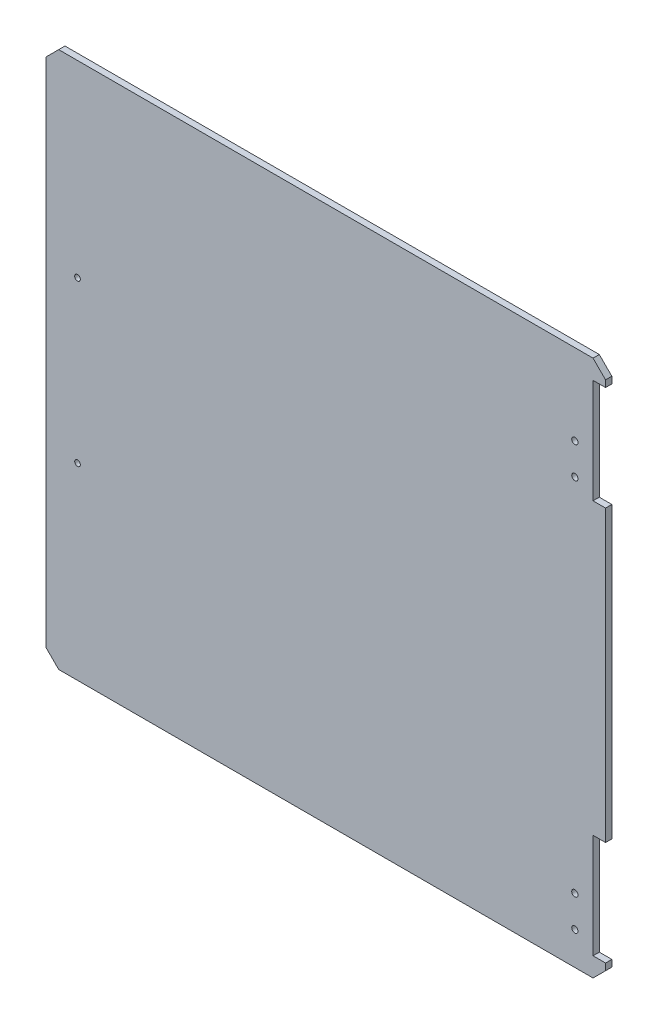
ISO-10303-21;
HEADER;
FILE_DESCRIPTION(('STEP AP214'),'2;1');
FILE_NAME('part.step','',(''),(''),'','','');
FILE_SCHEMA(('AUTOMOTIVE_DESIGN { 1 0 10303 214 1 1 1 1 }'));
ENDSEC;
DATA;
#1=APPLICATION_CONTEXT('core data for automotive mechanical design processes');
#2=APPLICATION_PROTOCOL_DEFINITION('international standard','automotive_design',2000,#1);
#3=PRODUCT_CONTEXT('',#1,'mechanical');
#4=PRODUCT('Part','Part','',(#3));
#5=PRODUCT_RELATED_PRODUCT_CATEGORY('part','',(#4));
#6=PRODUCT_DEFINITION_FORMATION('','',#4);
#7=PRODUCT_DEFINITION_CONTEXT('part definition',#1,'design');
#8=PRODUCT_DEFINITION('design','',#6,#7);
#9=PRODUCT_DEFINITION_SHAPE('','',#8);
#10=(LENGTH_UNIT() NAMED_UNIT(*) SI_UNIT(.MILLI.,.METRE.));
#11=(NAMED_UNIT(*) PLANE_ANGLE_UNIT() SI_UNIT($,.RADIAN.));
#12=(NAMED_UNIT(*) SI_UNIT($,.STERADIAN.) SOLID_ANGLE_UNIT());
#13=UNCERTAINTY_MEASURE_WITH_UNIT(LENGTH_MEASURE(1.E-05),#10,'distance_accuracy_value','');
#14=(GEOMETRIC_REPRESENTATION_CONTEXT(3) GLOBAL_UNCERTAINTY_ASSIGNED_CONTEXT((#13)) GLOBAL_UNIT_ASSIGNED_CONTEXT((#10,
#11,#12)) REPRESENTATION_CONTEXT('',''));
#15=CARTESIAN_POINT('',(0.,0.,0.));
#16=DIRECTION('',(0.,0.,1.));
#17=DIRECTION('',(1.,0.,0.));
#18=AXIS2_PLACEMENT_3D('',#15,#16,#17);
#19=CARTESIAN_POINT('',(0.,0.,5.));
#20=DIRECTION('',(0.,0.,1.));
#21=DIRECTION('',(1.,0.,0.));
#22=AXIS2_PLACEMENT_3D('',#19,#20,#21);
#23=PLANE('',#22);
#24=CARTESIAN_POINT('',(-198.,64.,5.));
#25=DIRECTION('',(0.,0.,1.));
#26=DIRECTION('',(1.,0.,0.));
#27=AXIS2_PLACEMENT_3D('',#24,#25,#26);
#28=CIRCLE('',#27,2.25000000000001);
#29=CARTESIAN_POINT('',(-195.75,64.,5.));
#30=VERTEX_POINT('',#29);
#31=EDGE_CURVE('E227',#30,#30,#28,.T.);
#32=ORIENTED_EDGE('',*,*,#31,.F.);
#33=EDGE_LOOP('',(#32));
#34=FACE_BOUND('',#33,.T.);
#35=CARTESIAN_POINT('',(198.49414030681,-162.747561794901,5.));
#36=DIRECTION('',(0.,0.,1.));
#37=DIRECTION('',(1.,0.,0.));
#38=AXIS2_PLACEMENT_3D('',#35,#36,#37);
#39=CIRCLE('',#38,2.49907206109209);
#40=CARTESIAN_POINT('',(200.993212367902,-162.747561794901,5.));
#41=VERTEX_POINT('',#40);
#42=EDGE_CURVE('E210',#41,#41,#39,.T.);
#43=ORIENTED_EDGE('',*,*,#42,.F.);
#44=EDGE_LOOP('',(#43));
#45=FACE_BOUND('',#44,.T.);
#46=CARTESIAN_POINT('',(198.517978049877,149.652449569862,5.));
#47=DIRECTION('',(0.,0.,1.));
#48=DIRECTION('',(1.,0.,0.));
#49=AXIS2_PLACEMENT_3D('',#46,#47,#48);
#50=CIRCLE('',#49,2.50000000003416);
#51=CARTESIAN_POINT('',(201.017978049911,149.652449569862,5.));
#52=VERTEX_POINT('',#51);
#53=EDGE_CURVE('E211',#52,#52,#50,.T.);
#54=ORIENTED_EDGE('',*,*,#53,.F.);
#55=EDGE_LOOP('',(#54));
#56=FACE_BOUND('',#55,.T.);
#57=DIRECTION('',(0.,-1.,0.));
#58=VECTOR('',#57,1.);
#59=CARTESIAN_POINT('',(-223.,-204.,5.));
#60=LINE('',#59,#58);
#61=CARTESIAN_POINT('',(-223.,204.,5.));
#62=VERTEX_POINT('',#61);
#63=CARTESIAN_POINT('',(-223.,-204.,5.));
#64=VERTEX_POINT('',#63);
#65=EDGE_CURVE('E240',#62,#64,#60,.T.);
#66=ORIENTED_EDGE('',*,*,#65,.T.);
#67=DIRECTION('',(0.707106781186548,-0.707106781186546,0.));
#68=VECTOR('',#67,1.);
#69=CARTESIAN_POINT('',(-213.,-214.,5.));
#70=LINE('',#69,#68);
#71=CARTESIAN_POINT('',(-213.,-214.,5.));
#72=VERTEX_POINT('',#71);
#73=EDGE_CURVE('E124',#64,#72,#70,.T.);
#74=ORIENTED_EDGE('',*,*,#73,.T.);
#75=DIRECTION('',(1.,0.,0.));
#76=VECTOR('',#75,1.);
#77=CARTESIAN_POINT('',(213.,-214.,5.));
#78=LINE('',#77,#76);
#79=CARTESIAN_POINT('',(213.,-214.,5.));
#80=VERTEX_POINT('',#79);
#81=EDGE_CURVE('E245',#72,#80,#78,.T.);
#82=ORIENTED_EDGE('',*,*,#81,.T.);
#83=DIRECTION('',(0.707106781186547,0.707106781186547,0.));
#84=VECTOR('',#83,1.);
#85=CARTESIAN_POINT('',(213.,-214.,5.));
#86=LINE('',#85,#84);
#87=CARTESIAN_POINT('',(223.,-204.,5.));
#88=VERTEX_POINT('',#87);
#89=EDGE_CURVE('E248',#80,#88,#86,.T.);
#90=ORIENTED_EDGE('',*,*,#89,.T.);
#91=DIRECTION('',(0.,1.,0.));
#92=VECTOR('',#91,1.);
#93=CARTESIAN_POINT('',(223.,-204.,5.));
#94=LINE('',#93,#92);
#95=CARTESIAN_POINT('',(223.,-198.658355402181,5.));
#96=VERTEX_POINT('',#95);
#97=EDGE_CURVE('E256',#88,#96,#94,.T.);
#98=ORIENTED_EDGE('',*,*,#97,.T.);
#99=DIRECTION('',(-1.,0.,0.));
#100=VECTOR('',#99,1.);
#101=CARTESIAN_POINT('',(223.,-198.658355402181,5.));
#102=LINE('',#101,#100);
#103=CARTESIAN_POINT('',(213.,-198.658355402181,5.));
#104=VERTEX_POINT('',#103);
#105=EDGE_CURVE('E258',#96,#104,#102,.T.);
#106=ORIENTED_EDGE('',*,*,#105,.T.);
#107=DIRECTION('',(0.,1.,0.));
#108=VECTOR('',#107,1.);
#109=CARTESIAN_POINT('',(213.,-198.658355402181,5.));
#110=LINE('',#109,#108);
#111=CARTESIAN_POINT('',(213.,-115.470714491178,5.));
#112=VERTEX_POINT('',#111);
#113=EDGE_CURVE('E261',#104,#112,#110,.T.);
#114=ORIENTED_EDGE('',*,*,#113,.T.);
#115=DIRECTION('',(1.,0.,0.));
#116=VECTOR('',#115,1.);
#117=CARTESIAN_POINT('',(213.,-115.470714491178,5.));
#118=LINE('',#117,#116);
#119=CARTESIAN_POINT('',(223.,-115.470714491178,5.));
#120=VERTEX_POINT('',#119);
#121=EDGE_CURVE('E264',#112,#120,#118,.T.);
#122=ORIENTED_EDGE('',*,*,#121,.T.);
#123=DIRECTION('',(0.,1.,0.));
#124=VECTOR('',#123,1.);
#125=CARTESIAN_POINT('',(223.,-115.470714491178,5.));
#126=LINE('',#125,#124);
#127=CARTESIAN_POINT('',(223.,115.470714491178,5.));
#128=VERTEX_POINT('',#127);
#129=EDGE_CURVE('E272',#120,#128,#126,.T.);
#130=ORIENTED_EDGE('',*,*,#129,.T.);
#131=DIRECTION('',(-1.,0.,0.));
#132=VECTOR('',#131,1.);
#133=CARTESIAN_POINT('',(213.,115.470714491178,5.));
#134=LINE('',#133,#132);
#135=CARTESIAN_POINT('',(213.,115.470714491178,5.));
#136=VERTEX_POINT('',#135);
#137=EDGE_CURVE('E274',#128,#136,#134,.T.);
#138=ORIENTED_EDGE('',*,*,#137,.T.);
#139=DIRECTION('',(0.,1.,0.));
#140=VECTOR('',#139,1.);
#141=CARTESIAN_POINT('',(213.,198.658355402181,5.));
#142=LINE('',#141,#140);
#143=CARTESIAN_POINT('',(213.,198.658355402181,5.));
#144=VERTEX_POINT('',#143);
#145=EDGE_CURVE('E277',#136,#144,#142,.T.);
#146=ORIENTED_EDGE('',*,*,#145,.T.);
#147=DIRECTION('',(1.,0.,0.));
#148=VECTOR('',#147,1.);
#149=CARTESIAN_POINT('',(223.,198.658355402181,5.));
#150=LINE('',#149,#148);
#151=CARTESIAN_POINT('',(223.,198.658355402181,5.));
#152=VERTEX_POINT('',#151);
#153=EDGE_CURVE('E280',#144,#152,#150,.T.);
#154=ORIENTED_EDGE('',*,*,#153,.T.);
#155=DIRECTION('',(0.,1.,0.));
#156=VECTOR('',#155,1.);
#157=CARTESIAN_POINT('',(223.,198.658355402181,5.));
#158=LINE('',#157,#156);
#159=CARTESIAN_POINT('',(223.,204.,5.));
#160=VERTEX_POINT('',#159);
#161=EDGE_CURVE('E167',#152,#160,#158,.T.);
#162=ORIENTED_EDGE('',*,*,#161,.T.);
#163=DIRECTION('',(-0.707106781186547,0.707106781186547,0.));
#164=VECTOR('',#163,1.);
#165=CARTESIAN_POINT('',(223.,204.,5.));
#166=LINE('',#165,#164);
#167=CARTESIAN_POINT('',(213.,214.,5.));
#168=VERTEX_POINT('',#167);
#169=EDGE_CURVE('E161',#160,#168,#166,.T.);
#170=ORIENTED_EDGE('',*,*,#169,.T.);
#171=DIRECTION('',(-1.,0.,0.));
#172=VECTOR('',#171,1.);
#173=CARTESIAN_POINT('',(213.,214.,5.));
#174=LINE('',#173,#172);
#175=CARTESIAN_POINT('',(-213.,214.,5.));
#176=VERTEX_POINT('',#175);
#177=EDGE_CURVE('E165',#168,#176,#174,.T.);
#178=ORIENTED_EDGE('',*,*,#177,.T.);
#179=DIRECTION('',(-0.70710678118655,-0.707106781186544,0.));
#180=VECTOR('',#179,1.);
#181=CARTESIAN_POINT('',(-223.,204.,5.));
#182=LINE('',#181,#180);
#183=EDGE_CURVE('E57',#176,#62,#182,.T.);
#184=ORIENTED_EDGE('',*,*,#183,.T.);
#185=EDGE_LOOP('',(#66,#74,#82,#90,#98,#106,#114,#122,#130,#138,#146,#154,#162,#170,#178,#184));
#186=FACE_BOUND('',#185,.T.);
#187=CARTESIAN_POINT('',(198.517978049877,124.652449569862,5.));
#188=DIRECTION('',(0.,0.,1.));
#189=DIRECTION('',(1.,0.,0.));
#190=AXIS2_PLACEMENT_3D('',#187,#188,#189);
#191=CIRCLE('',#190,2.50000000003416);
#192=CARTESIAN_POINT('',(201.017978049911,124.652449569862,5.));
#193=VERTEX_POINT('',#192);
#194=EDGE_CURVE('E197',#193,#193,#191,.T.);
#195=ORIENTED_EDGE('',*,*,#194,.F.);
#196=EDGE_LOOP('',(#195));
#197=FACE_BOUND('',#196,.T.);
#198=CARTESIAN_POINT('',(198.517978049875,-187.747550430138,5.));
#199=DIRECTION('',(0.,0.,1.));
#200=DIRECTION('',(1.,0.,0.));
#201=AXIS2_PLACEMENT_3D('',#198,#199,#200);
#202=CIRCLE('',#201,2.49907206109211);
#203=CARTESIAN_POINT('',(201.017050110967,-187.747550430138,5.));
#204=VERTEX_POINT('',#203);
#205=EDGE_CURVE('E226',#204,#204,#202,.T.);
#206=ORIENTED_EDGE('',*,*,#205,.F.);
#207=EDGE_LOOP('',(#206));
#208=FACE_BOUND('',#207,.T.);
#209=CARTESIAN_POINT('',(-198.,-64.,5.));
#210=DIRECTION('',(0.,0.,1.));
#211=DIRECTION('',(-1.,0.,0.));
#212=AXIS2_PLACEMENT_3D('',#209,#210,#211);
#213=CIRCLE('',#212,2.25000000000001);
#214=CARTESIAN_POINT('',(-200.25,-64.,5.));
#215=VERTEX_POINT('',#214);
#216=EDGE_CURVE('E527',#215,#215,#213,.T.);
#217=ORIENTED_EDGE('',*,*,#216,.F.);
#218=EDGE_LOOP('',(#217));
#219=FACE_BOUND('',#218,.T.);
#220=ADVANCED_FACE('F39',(#34,#45,#56,#186,#197,#208,#219),#23,.T.);
#221=CARTESIAN_POINT('',(0.,0.,0.));
#222=DIRECTION('',(0.,0.,1.));
#223=DIRECTION('',(1.,0.,0.));
#224=AXIS2_PLACEMENT_3D('',#221,#222,#223);
#225=PLANE('',#224);
#226=DIRECTION('',(0.,-1.,0.));
#227=VECTOR('',#226,1.);
#228=CARTESIAN_POINT('',(-223.,-204.,0.));
#229=LINE('',#228,#227);
#230=CARTESIAN_POINT('',(-223.,204.,0.));
#231=VERTEX_POINT('',#230);
#232=CARTESIAN_POINT('',(-223.,-204.,0.));
#233=VERTEX_POINT('',#232);
#234=EDGE_CURVE('E369',#231,#233,#229,.T.);
#235=ORIENTED_EDGE('',*,*,#234,.F.);
#236=DIRECTION('',(-0.70710678118655,-0.707106781186544,0.));
#237=VECTOR('',#236,1.);
#238=CARTESIAN_POINT('',(-223.,204.,0.));
#239=LINE('',#238,#237);
#240=CARTESIAN_POINT('',(-213.,214.,0.));
#241=VERTEX_POINT('',#240);
#242=EDGE_CURVE('E116',#241,#231,#239,.T.);
#243=ORIENTED_EDGE('',*,*,#242,.F.);
#244=DIRECTION('',(-1.,0.,0.));
#245=VECTOR('',#244,1.);
#246=CARTESIAN_POINT('',(213.,214.,0.));
#247=LINE('',#246,#245);
#248=CARTESIAN_POINT('',(213.,214.,0.));
#249=VERTEX_POINT('',#248);
#250=EDGE_CURVE('E110',#249,#241,#247,.T.);
#251=ORIENTED_EDGE('',*,*,#250,.F.);
#252=DIRECTION('',(-0.707106781186547,0.707106781186547,0.));
#253=VECTOR('',#252,1.);
#254=CARTESIAN_POINT('',(223.,204.,0.));
#255=LINE('',#254,#253);
#256=CARTESIAN_POINT('',(223.,204.,0.));
#257=VERTEX_POINT('',#256);
#258=EDGE_CURVE('E175',#257,#249,#255,.T.);
#259=ORIENTED_EDGE('',*,*,#258,.F.);
#260=DIRECTION('',(0.,1.,0.));
#261=VECTOR('',#260,1.);
#262=CARTESIAN_POINT('',(223.,198.658355402181,0.));
#263=LINE('',#262,#261);
#264=CARTESIAN_POINT('',(223.,198.658355402181,0.));
#265=VERTEX_POINT('',#264);
#266=EDGE_CURVE('E300',#265,#257,#263,.T.);
#267=ORIENTED_EDGE('',*,*,#266,.F.);
#268=DIRECTION('',(1.,0.,0.));
#269=VECTOR('',#268,1.);
#270=CARTESIAN_POINT('',(223.,198.658355402181,0.));
#271=LINE('',#270,#269);
#272=CARTESIAN_POINT('',(213.,198.658355402181,0.));
#273=VERTEX_POINT('',#272);
#274=EDGE_CURVE('E294',#273,#265,#271,.T.);
#275=ORIENTED_EDGE('',*,*,#274,.F.);
#276=DIRECTION('',(0.,1.,0.));
#277=VECTOR('',#276,1.);
#278=CARTESIAN_POINT('',(213.,198.658355402181,0.));
#279=LINE('',#278,#277);
#280=CARTESIAN_POINT('',(213.,115.470714491178,0.));
#281=VERTEX_POINT('',#280);
#282=EDGE_CURVE('E401',#281,#273,#279,.T.);
#283=ORIENTED_EDGE('',*,*,#282,.F.);
#284=DIRECTION('',(-1.,0.,0.));
#285=VECTOR('',#284,1.);
#286=CARTESIAN_POINT('',(213.,115.470714491178,0.));
#287=LINE('',#286,#285);
#288=CARTESIAN_POINT('',(223.,115.470714491178,0.));
#289=VERTEX_POINT('',#288);
#290=EDGE_CURVE('E398',#289,#281,#287,.T.);
#291=ORIENTED_EDGE('',*,*,#290,.F.);
#292=DIRECTION('',(0.,1.,0.));
#293=VECTOR('',#292,1.);
#294=CARTESIAN_POINT('',(223.,-115.470714491178,0.));
#295=LINE('',#294,#293);
#296=CARTESIAN_POINT('',(223.,-115.470714491178,0.));
#297=VERTEX_POINT('',#296);
#298=EDGE_CURVE('E396',#297,#289,#295,.T.);
#299=ORIENTED_EDGE('',*,*,#298,.F.);
#300=DIRECTION('',(1.,0.,0.));
#301=VECTOR('',#300,1.);
#302=CARTESIAN_POINT('',(213.,-115.470714491178,0.));
#303=LINE('',#302,#301);
#304=CARTESIAN_POINT('',(213.,-115.470714491178,0.));
#305=VERTEX_POINT('',#304);
#306=EDGE_CURVE('E388',#305,#297,#303,.T.);
#307=ORIENTED_EDGE('',*,*,#306,.F.);
#308=DIRECTION('',(0.,1.,0.));
#309=VECTOR('',#308,1.);
#310=CARTESIAN_POINT('',(213.,-198.658355402181,0.));
#311=LINE('',#310,#309);
#312=CARTESIAN_POINT('',(213.,-198.658355402181,0.));
#313=VERTEX_POINT('',#312);
#314=EDGE_CURVE('E385',#313,#305,#311,.T.);
#315=ORIENTED_EDGE('',*,*,#314,.F.);
#316=DIRECTION('',(-1.,0.,0.));
#317=VECTOR('',#316,1.);
#318=CARTESIAN_POINT('',(223.,-198.658355402181,0.));
#319=LINE('',#318,#317);
#320=CARTESIAN_POINT('',(223.,-198.658355402181,0.));
#321=VERTEX_POINT('',#320);
#322=EDGE_CURVE('E382',#321,#313,#319,.T.);
#323=ORIENTED_EDGE('',*,*,#322,.F.);
#324=DIRECTION('',(0.,1.,0.));
#325=VECTOR('',#324,1.);
#326=CARTESIAN_POINT('',(223.,-204.,0.));
#327=LINE('',#326,#325);
#328=CARTESIAN_POINT('',(223.,-204.,0.));
#329=VERTEX_POINT('',#328);
#330=EDGE_CURVE('E367',#329,#321,#327,.T.);
#331=ORIENTED_EDGE('',*,*,#330,.F.);
#332=DIRECTION('',(0.707106781186547,0.707106781186547,0.));
#333=VECTOR('',#332,1.);
#334=CARTESIAN_POINT('',(213.,-214.,0.));
#335=LINE('',#334,#333);
#336=CARTESIAN_POINT('',(213.,-214.,0.));
#337=VERTEX_POINT('',#336);
#338=EDGE_CURVE('E365',#337,#329,#335,.T.);
#339=ORIENTED_EDGE('',*,*,#338,.F.);
#340=DIRECTION('',(1.,0.,0.));
#341=VECTOR('',#340,1.);
#342=CARTESIAN_POINT('',(213.,-214.,0.));
#343=LINE('',#342,#341);
#344=CARTESIAN_POINT('',(-213.,-214.,0.));
#345=VERTEX_POINT('',#344);
#346=EDGE_CURVE('E357',#345,#337,#343,.T.);
#347=ORIENTED_EDGE('',*,*,#346,.F.);
#348=DIRECTION('',(0.707106781186548,-0.707106781186546,0.));
#349=VECTOR('',#348,1.);
#350=CARTESIAN_POINT('',(-213.,-214.,0.));
#351=LINE('',#350,#349);
#352=EDGE_CURVE('E363',#233,#345,#351,.T.);
#353=ORIENTED_EDGE('',*,*,#352,.F.);
#354=EDGE_LOOP('',(#235,#243,#251,#259,#267,#275,#283,#291,#299,#307,#315,#323,#331,#339,#347,#353));
#355=FACE_BOUND('',#354,.T.);
#356=CARTESIAN_POINT('',(198.517978049877,149.652449569862,0.));
#357=DIRECTION('',(0.,0.,1.));
#358=DIRECTION('',(1.,0.,0.));
#359=AXIS2_PLACEMENT_3D('',#356,#357,#358);
#360=CIRCLE('',#359,2.50000000003416);
#361=CARTESIAN_POINT('',(201.017978049911,149.652449569862,0.));
#362=VERTEX_POINT('',#361);
#363=EDGE_CURVE('E202',#362,#362,#360,.T.);
#364=ORIENTED_EDGE('',*,*,#363,.T.);
#365=EDGE_LOOP('',(#364));
#366=FACE_BOUND('',#365,.T.);
#367=CARTESIAN_POINT('',(198.517978049877,124.652449569862,0.));
#368=DIRECTION('',(0.,0.,1.));
#369=DIRECTION('',(1.,0.,0.));
#370=AXIS2_PLACEMENT_3D('',#367,#368,#369);
#371=CIRCLE('',#370,2.50000000003416);
#372=CARTESIAN_POINT('',(201.017978049911,124.652449569862,0.));
#373=VERTEX_POINT('',#372);
#374=EDGE_CURVE('E203',#373,#373,#371,.T.);
#375=ORIENTED_EDGE('',*,*,#374,.T.);
#376=EDGE_LOOP('',(#375));
#377=FACE_BOUND('',#376,.T.);
#378=CARTESIAN_POINT('',(198.49414030681,-162.747561794901,0.));
#379=DIRECTION('',(0.,0.,1.));
#380=DIRECTION('',(1.,0.,0.));
#381=AXIS2_PLACEMENT_3D('',#378,#379,#380);
#382=CIRCLE('',#381,2.49907206109209);
#383=CARTESIAN_POINT('',(200.993212367902,-162.747561794901,0.));
#384=VERTEX_POINT('',#383);
#385=EDGE_CURVE('E204',#384,#384,#382,.T.);
#386=ORIENTED_EDGE('',*,*,#385,.T.);
#387=EDGE_LOOP('',(#386));
#388=FACE_BOUND('',#387,.T.);
#389=CARTESIAN_POINT('',(198.517978049875,-187.747550430138,0.));
#390=DIRECTION('',(0.,0.,1.));
#391=DIRECTION('',(1.,0.,0.));
#392=AXIS2_PLACEMENT_3D('',#389,#390,#391);
#393=CIRCLE('',#392,2.49907206109211);
#394=CARTESIAN_POINT('',(201.017050110967,-187.747550430138,0.));
#395=VERTEX_POINT('',#394);
#396=EDGE_CURVE('E223',#395,#395,#393,.T.);
#397=ORIENTED_EDGE('',*,*,#396,.T.);
#398=EDGE_LOOP('',(#397));
#399=FACE_BOUND('',#398,.T.);
#400=CARTESIAN_POINT('',(-198.,64.,0.));
#401=DIRECTION('',(0.,0.,1.));
#402=DIRECTION('',(1.,0.,0.));
#403=AXIS2_PLACEMENT_3D('',#400,#401,#402);
#404=CIRCLE('',#403,2.25000000000001);
#405=CARTESIAN_POINT('',(-195.75,64.,0.));
#406=VERTEX_POINT('',#405);
#407=EDGE_CURVE('E531',#406,#406,#404,.T.);
#408=ORIENTED_EDGE('',*,*,#407,.T.);
#409=EDGE_LOOP('',(#408));
#410=FACE_BOUND('',#409,.T.);
#411=CARTESIAN_POINT('',(-198.,-64.,0.));
#412=DIRECTION('',(0.,0.,1.));
#413=DIRECTION('',(-1.,0.,0.));
#414=AXIS2_PLACEMENT_3D('',#411,#412,#413);
#415=CIRCLE('',#414,2.25000000000001);
#416=CARTESIAN_POINT('',(-200.25,-64.,0.));
#417=VERTEX_POINT('',#416);
#418=EDGE_CURVE('E532',#417,#417,#415,.T.);
#419=ORIENTED_EDGE('',*,*,#418,.T.);
#420=EDGE_LOOP('',(#419));
#421=FACE_BOUND('',#420,.T.);
#422=ADVANCED_FACE('F361',(#355,#366,#377,#388,#399,#410,#421),#225,.F.);
#423=CARTESIAN_POINT('',(-223.,-204.,5.));
#424=DIRECTION('',(1.,0.,0.));
#425=DIRECTION('',(0.,1.,0.));
#426=AXIS2_PLACEMENT_3D('',#423,#424,#425);
#427=PLANE('',#426);
#428=ORIENTED_EDGE('',*,*,#234,.T.);
#429=DIRECTION('',(0.,0.,-1.));
#430=VECTOR('',#429,1.);
#431=CARTESIAN_POINT('',(-223.,-204.,5.));
#432=LINE('',#431,#430);
#433=EDGE_CURVE('E12',#64,#233,#432,.T.);
#434=ORIENTED_EDGE('',*,*,#433,.F.);
#435=ORIENTED_EDGE('',*,*,#65,.F.);
#436=DIRECTION('',(0.,0.,-1.));
#437=VECTOR('',#436,1.);
#438=CARTESIAN_POINT('',(-223.,204.,5.));
#439=LINE('',#438,#437);
#440=EDGE_CURVE('E181',#62,#231,#439,.T.);
#441=ORIENTED_EDGE('',*,*,#440,.T.);
#442=EDGE_LOOP('',(#428,#434,#435,#441));
#443=FACE_BOUND('',#442,.T.);
#444=ADVANCED_FACE('F41',(#443),#427,.F.);
#445=CARTESIAN_POINT('',(-213.,-214.,5.));
#446=DIRECTION('',(0.707106781186546,0.707106781186548,0.));
#447=DIRECTION('',(-0.707106781186549,0.707106781186547,0.));
#448=AXIS2_PLACEMENT_3D('',#445,#446,#447);
#449=PLANE('',#448);
#450=ORIENTED_EDGE('',*,*,#352,.T.);
#451=DIRECTION('',(0.,0.,-1.));
#452=VECTOR('',#451,1.);
#453=CARTESIAN_POINT('',(-213.,-214.,5.));
#454=LINE('',#453,#452);
#455=EDGE_CURVE('E49',#72,#345,#454,.T.);
#456=ORIENTED_EDGE('',*,*,#455,.F.);
#457=ORIENTED_EDGE('',*,*,#73,.F.);
#458=ORIENTED_EDGE('',*,*,#433,.T.);
#459=EDGE_LOOP('',(#450,#456,#457,#458));
#460=FACE_BOUND('',#459,.T.);
#461=ADVANCED_FACE('F495',(#460),#449,.F.);
#462=CARTESIAN_POINT('',(213.,-214.,5.));
#463=DIRECTION('',(0.,1.,0.));
#464=DIRECTION('',(-1.,0.,0.));
#465=AXIS2_PLACEMENT_3D('',#462,#463,#464);
#466=PLANE('',#465);
#467=ORIENTED_EDGE('',*,*,#346,.T.);
#468=DIRECTION('',(0.,0.,-1.));
#469=VECTOR('',#468,1.);
#470=CARTESIAN_POINT('',(213.,-214.,5.));
#471=LINE('',#470,#469);
#472=EDGE_CURVE('E347',#80,#337,#471,.T.);
#473=ORIENTED_EDGE('',*,*,#472,.F.);
#474=ORIENTED_EDGE('',*,*,#81,.F.);
#475=ORIENTED_EDGE('',*,*,#455,.T.);
#476=EDGE_LOOP('',(#467,#473,#474,#475));
#477=FACE_BOUND('',#476,.T.);
#478=ADVANCED_FACE('F355',(#477),#466,.F.);
#479=CARTESIAN_POINT('',(213.,-214.,5.));
#480=DIRECTION('',(-0.707106781186548,0.707106781186548,0.));
#481=DIRECTION('',(-0.707106781186548,-0.707106781186548,0.));
#482=AXIS2_PLACEMENT_3D('',#479,#480,#481);
#483=PLANE('',#482);
#484=ORIENTED_EDGE('',*,*,#338,.T.);
#485=DIRECTION('',(0.,0.,-1.));
#486=VECTOR('',#485,1.);
#487=CARTESIAN_POINT('',(223.,-204.,5.));
#488=LINE('',#487,#486);
#489=EDGE_CURVE('E340',#88,#329,#488,.T.);
#490=ORIENTED_EDGE('',*,*,#489,.F.);
#491=ORIENTED_EDGE('',*,*,#89,.F.);
#492=ORIENTED_EDGE('',*,*,#472,.T.);
#493=EDGE_LOOP('',(#484,#490,#491,#492));
#494=FACE_BOUND('',#493,.T.);
#495=ADVANCED_FACE('F489',(#494),#483,.F.);
#496=CARTESIAN_POINT('',(223.,-204.,5.));
#497=DIRECTION('',(-1.,0.,0.));
#498=DIRECTION('',(0.,0.,1.));
#499=AXIS2_PLACEMENT_3D('',#496,#497,#498);
#500=PLANE('',#499);
#501=ORIENTED_EDGE('',*,*,#330,.T.);
#502=DIRECTION('',(0.,0.,-1.));
#503=VECTOR('',#502,1.);
#504=CARTESIAN_POINT('',(223.,-198.658355402181,5.));
#505=LINE('',#504,#503);
#506=EDGE_CURVE('E336',#96,#321,#505,.T.);
#507=ORIENTED_EDGE('',*,*,#506,.F.);
#508=ORIENTED_EDGE('',*,*,#97,.F.);
#509=ORIENTED_EDGE('',*,*,#489,.T.);
#510=EDGE_LOOP('',(#501,#507,#508,#509));
#511=FACE_BOUND('',#510,.T.);
#512=ADVANCED_FACE('F485',(#511),#500,.F.);
#513=CARTESIAN_POINT('',(223.,-198.658355402181,5.));
#514=DIRECTION('',(0.,-1.,0.));
#515=DIRECTION('',(0.,0.,-1.));
#516=AXIS2_PLACEMENT_3D('',#513,#514,#515);
#517=PLANE('',#516);
#518=ORIENTED_EDGE('',*,*,#322,.T.);
#519=DIRECTION('',(0.,0.,-1.));
#520=VECTOR('',#519,1.);
#521=CARTESIAN_POINT('',(213.,-198.658355402181,5.));
#522=LINE('',#521,#520);
#523=EDGE_CURVE('E332',#104,#313,#522,.T.);
#524=ORIENTED_EDGE('',*,*,#523,.F.);
#525=ORIENTED_EDGE('',*,*,#105,.F.);
#526=ORIENTED_EDGE('',*,*,#506,.T.);
#527=EDGE_LOOP('',(#518,#524,#525,#526));
#528=FACE_BOUND('',#527,.T.);
#529=ADVANCED_FACE('F481',(#528),#517,.F.);
#530=CARTESIAN_POINT('',(213.,-198.658355402181,5.));
#531=DIRECTION('',(-1.,0.,0.));
#532=DIRECTION('',(0.,0.,1.));
#533=AXIS2_PLACEMENT_3D('',#530,#531,#532);
#534=PLANE('',#533);
#535=ORIENTED_EDGE('',*,*,#314,.T.);
#536=DIRECTION('',(0.,0.,-1.));
#537=VECTOR('',#536,1.);
#538=CARTESIAN_POINT('',(213.,-115.470714491178,5.));
#539=LINE('',#538,#537);
#540=EDGE_CURVE('E329',#112,#305,#539,.T.);
#541=ORIENTED_EDGE('',*,*,#540,.F.);
#542=ORIENTED_EDGE('',*,*,#113,.F.);
#543=ORIENTED_EDGE('',*,*,#523,.T.);
#544=EDGE_LOOP('',(#535,#541,#542,#543));
#545=FACE_BOUND('',#544,.T.);
#546=ADVANCED_FACE('F477',(#545),#534,.F.);
#547=CARTESIAN_POINT('',(213.,-115.470714491178,5.));
#548=DIRECTION('',(0.,1.,0.));
#549=DIRECTION('',(0.,0.,1.));
#550=AXIS2_PLACEMENT_3D('',#547,#548,#549);
#551=PLANE('',#550);
#552=ORIENTED_EDGE('',*,*,#306,.T.);
#553=DIRECTION('',(0.,0.,-1.));
#554=VECTOR('',#553,1.);
#555=CARTESIAN_POINT('',(223.,-115.470714491178,5.));
#556=LINE('',#555,#554);
#557=EDGE_CURVE('E321',#120,#297,#556,.T.);
#558=ORIENTED_EDGE('',*,*,#557,.F.);
#559=ORIENTED_EDGE('',*,*,#121,.F.);
#560=ORIENTED_EDGE('',*,*,#540,.T.);
#561=EDGE_LOOP('',(#552,#558,#559,#560));
#562=FACE_BOUND('',#561,.T.);
#563=ADVANCED_FACE('F473',(#562),#551,.F.);
#564=CARTESIAN_POINT('',(223.,-115.470714491178,5.));
#565=DIRECTION('',(-1.,0.,0.));
#566=DIRECTION('',(0.,-1.,0.));
#567=AXIS2_PLACEMENT_3D('',#564,#565,#566);
#568=PLANE('',#567);
#569=ORIENTED_EDGE('',*,*,#298,.T.);
#570=DIRECTION('',(0.,0.,-1.));
#571=VECTOR('',#570,1.);
#572=CARTESIAN_POINT('',(223.,115.470714491178,5.));
#573=LINE('',#572,#571);
#574=EDGE_CURVE('E317',#128,#289,#573,.T.);
#575=ORIENTED_EDGE('',*,*,#574,.F.);
#576=ORIENTED_EDGE('',*,*,#129,.F.);
#577=ORIENTED_EDGE('',*,*,#557,.T.);
#578=EDGE_LOOP('',(#569,#575,#576,#577));
#579=FACE_BOUND('',#578,.T.);
#580=ADVANCED_FACE('F469',(#579),#568,.F.);
#581=CARTESIAN_POINT('',(213.,115.470714491178,5.));
#582=DIRECTION('',(0.,-1.,0.));
#583=DIRECTION('',(0.,0.,-1.));
#584=AXIS2_PLACEMENT_3D('',#581,#582,#583);
#585=PLANE('',#584);
#586=ORIENTED_EDGE('',*,*,#290,.T.);
#587=DIRECTION('',(0.,0.,-1.));
#588=VECTOR('',#587,1.);
#589=CARTESIAN_POINT('',(213.,115.470714491178,5.));
#590=LINE('',#589,#588);
#591=EDGE_CURVE('E313',#136,#281,#590,.T.);
#592=ORIENTED_EDGE('',*,*,#591,.F.);
#593=ORIENTED_EDGE('',*,*,#137,.F.);
#594=ORIENTED_EDGE('',*,*,#574,.T.);
#595=EDGE_LOOP('',(#586,#592,#593,#594));
#596=FACE_BOUND('',#595,.T.);
#597=ADVANCED_FACE('F465',(#596),#585,.F.);
#598=CARTESIAN_POINT('',(213.,198.658355402181,5.));
#599=DIRECTION('',(-1.,0.,0.));
#600=DIRECTION('',(0.,0.,1.));
#601=AXIS2_PLACEMENT_3D('',#598,#599,#600);
#602=PLANE('',#601);
#603=ORIENTED_EDGE('',*,*,#282,.T.);
#604=DIRECTION('',(0.,0.,-1.));
#605=VECTOR('',#604,1.);
#606=CARTESIAN_POINT('',(213.,198.658355402181,5.));
#607=LINE('',#606,#605);
#608=EDGE_CURVE('E297',#144,#273,#607,.T.);
#609=ORIENTED_EDGE('',*,*,#608,.F.);
#610=ORIENTED_EDGE('',*,*,#145,.F.);
#611=ORIENTED_EDGE('',*,*,#591,.T.);
#612=EDGE_LOOP('',(#603,#609,#610,#611));
#613=FACE_BOUND('',#612,.T.);
#614=ADVANCED_FACE('F462',(#613),#602,.F.);
#615=CARTESIAN_POINT('',(223.,198.658355402181,5.));
#616=DIRECTION('',(0.,1.,0.));
#617=DIRECTION('',(0.,0.,1.));
#618=AXIS2_PLACEMENT_3D('',#615,#616,#617);
#619=PLANE('',#618);
#620=ORIENTED_EDGE('',*,*,#274,.T.);
#621=DIRECTION('',(0.,0.,-1.));
#622=VECTOR('',#621,1.);
#623=CARTESIAN_POINT('',(223.,198.658355402181,5.));
#624=LINE('',#623,#622);
#625=EDGE_CURVE('E291',#152,#265,#624,.T.);
#626=ORIENTED_EDGE('',*,*,#625,.F.);
#627=ORIENTED_EDGE('',*,*,#153,.F.);
#628=ORIENTED_EDGE('',*,*,#608,.T.);
#629=EDGE_LOOP('',(#620,#626,#627,#628));
#630=FACE_BOUND('',#629,.T.);
#631=ADVANCED_FACE('F292',(#630),#619,.F.);
#632=CARTESIAN_POINT('',(223.,198.658355402181,5.));
#633=DIRECTION('',(-1.,0.,0.));
#634=DIRECTION('',(0.,-1.,0.));
#635=AXIS2_PLACEMENT_3D('',#632,#633,#634);
#636=PLANE('',#635);
#637=ORIENTED_EDGE('',*,*,#266,.T.);
#638=DIRECTION('',(0.,0.,-1.));
#639=VECTOR('',#638,1.);
#640=CARTESIAN_POINT('',(223.,204.,5.));
#641=LINE('',#640,#639);
#642=EDGE_CURVE('E176',#160,#257,#641,.T.);
#643=ORIENTED_EDGE('',*,*,#642,.F.);
#644=ORIENTED_EDGE('',*,*,#161,.F.);
#645=ORIENTED_EDGE('',*,*,#625,.T.);
#646=EDGE_LOOP('',(#637,#643,#644,#645));
#647=FACE_BOUND('',#646,.T.);
#648=ADVANCED_FACE('F299',(#647),#636,.F.);
#649=CARTESIAN_POINT('',(223.,204.,5.));
#650=DIRECTION('',(-0.707106781186548,-0.707106781186548,0.));
#651=DIRECTION('',(0.707106781186548,-0.707106781186548,0.));
#652=AXIS2_PLACEMENT_3D('',#649,#650,#651);
#653=PLANE('',#652);
#654=ORIENTED_EDGE('',*,*,#258,.T.);
#655=DIRECTION('',(0.,0.,-1.));
#656=VECTOR('',#655,1.);
#657=CARTESIAN_POINT('',(213.,214.,5.));
#658=LINE('',#657,#656);
#659=EDGE_CURVE('E172',#168,#249,#658,.T.);
#660=ORIENTED_EDGE('',*,*,#659,.F.);
#661=ORIENTED_EDGE('',*,*,#169,.F.);
#662=ORIENTED_EDGE('',*,*,#642,.T.);
#663=EDGE_LOOP('',(#654,#660,#661,#662));
#664=FACE_BOUND('',#663,.T.);
#665=ADVANCED_FACE('F173',(#664),#653,.F.);
#666=CARTESIAN_POINT('',(213.,214.,5.));
#667=DIRECTION('',(0.,-1.,0.));
#668=DIRECTION('',(1.,0.,0.));
#669=AXIS2_PLACEMENT_3D('',#666,#667,#668);
#670=PLANE('',#669);
#671=ORIENTED_EDGE('',*,*,#250,.T.);
#672=DIRECTION('',(0.,0.,-1.));
#673=VECTOR('',#672,1.);
#674=CARTESIAN_POINT('',(-213.,214.,5.));
#675=LINE('',#674,#673);
#676=EDGE_CURVE('E177',#176,#241,#675,.T.);
#677=ORIENTED_EDGE('',*,*,#676,.F.);
#678=ORIENTED_EDGE('',*,*,#177,.F.);
#679=ORIENTED_EDGE('',*,*,#659,.T.);
#680=EDGE_LOOP('',(#671,#677,#678,#679));
#681=FACE_BOUND('',#680,.T.);
#682=ADVANCED_FACE('F179',(#681),#670,.F.);
#683=CARTESIAN_POINT('',(-223.,204.,5.));
#684=DIRECTION('',(0.707106781186544,-0.70710678118655,0.));
#685=DIRECTION('',(0.70710678118655,0.707106781186545,0.));
#686=AXIS2_PLACEMENT_3D('',#683,#684,#685);
#687=PLANE('',#686);
#688=ORIENTED_EDGE('',*,*,#242,.T.);
#689=ORIENTED_EDGE('',*,*,#440,.F.);
#690=ORIENTED_EDGE('',*,*,#183,.F.);
#691=ORIENTED_EDGE('',*,*,#676,.T.);
#692=EDGE_LOOP('',(#688,#689,#690,#691));
#693=FACE_BOUND('',#692,.T.);
#694=ADVANCED_FACE('F434',(#693),#687,.F.);
#695=CARTESIAN_POINT('',(198.517978049877,149.652449569862,5.));
#696=DIRECTION('',(0.,0.,-1.));
#697=DIRECTION('',(-1.,0.,0.));
#698=AXIS2_PLACEMENT_3D('',#695,#696,#697);
#699=CYLINDRICAL_SURFACE('',#698,2.50000000003416);
#700=ORIENTED_EDGE('',*,*,#53,.T.);
#701=EDGE_LOOP('',(#700));
#702=FACE_BOUND('',#701,.T.);
#703=ORIENTED_EDGE('',*,*,#363,.F.);
#704=EDGE_LOOP('',(#703));
#705=FACE_BOUND('',#704,.T.);
#706=ADVANCED_FACE('F431',(#702,#705),#699,.F.);
#707=CARTESIAN_POINT('',(198.517978049877,124.652449569862,5.));
#708=DIRECTION('',(0.,0.,-1.));
#709=DIRECTION('',(-1.,0.,0.));
#710=AXIS2_PLACEMENT_3D('',#707,#708,#709);
#711=CYLINDRICAL_SURFACE('',#710,2.50000000003416);
#712=ORIENTED_EDGE('',*,*,#194,.T.);
#713=EDGE_LOOP('',(#712));
#714=FACE_BOUND('',#713,.T.);
#715=ORIENTED_EDGE('',*,*,#374,.F.);
#716=EDGE_LOOP('',(#715));
#717=FACE_BOUND('',#716,.T.);
#718=ADVANCED_FACE('F433',(#714,#717),#711,.F.);
#719=CARTESIAN_POINT('',(198.49414030681,-162.747561794901,5.));
#720=DIRECTION('',(0.,0.,-1.));
#721=DIRECTION('',(-1.,0.,0.));
#722=AXIS2_PLACEMENT_3D('',#719,#720,#721);
#723=CYLINDRICAL_SURFACE('',#722,2.49907206109209);
#724=ORIENTED_EDGE('',*,*,#42,.T.);
#725=EDGE_LOOP('',(#724));
#726=FACE_BOUND('',#725,.T.);
#727=ORIENTED_EDGE('',*,*,#385,.F.);
#728=EDGE_LOOP('',(#727));
#729=FACE_BOUND('',#728,.T.);
#730=ADVANCED_FACE('F440',(#726,#729),#723,.F.);
#731=CARTESIAN_POINT('',(198.517978049875,-187.747550430138,5.));
#732=DIRECTION('',(0.,0.,-1.));
#733=DIRECTION('',(-1.,0.,0.));
#734=AXIS2_PLACEMENT_3D('',#731,#732,#733);
#735=CYLINDRICAL_SURFACE('',#734,2.49907206109211);
#736=ORIENTED_EDGE('',*,*,#205,.T.);
#737=EDGE_LOOP('',(#736));
#738=FACE_BOUND('',#737,.T.);
#739=ORIENTED_EDGE('',*,*,#396,.F.);
#740=EDGE_LOOP('',(#739));
#741=FACE_BOUND('',#740,.T.);
#742=ADVANCED_FACE('F546',(#738,#741),#735,.F.);
#743=CARTESIAN_POINT('',(-198.,64.,5.));
#744=DIRECTION('',(0.,0.,-1.));
#745=DIRECTION('',(-1.,0.,0.));
#746=AXIS2_PLACEMENT_3D('',#743,#744,#745);
#747=CYLINDRICAL_SURFACE('',#746,2.25000000000001);
#748=ORIENTED_EDGE('',*,*,#31,.T.);
#749=EDGE_LOOP('',(#748));
#750=FACE_BOUND('',#749,.T.);
#751=ORIENTED_EDGE('',*,*,#407,.F.);
#752=EDGE_LOOP('',(#751));
#753=FACE_BOUND('',#752,.T.);
#754=ADVANCED_FACE('F543',(#750,#753),#747,.F.);
#755=CARTESIAN_POINT('',(-198.,-64.,5.));
#756=DIRECTION('',(0.,0.,-1.));
#757=DIRECTION('',(-1.,0.,0.));
#758=AXIS2_PLACEMENT_3D('',#755,#756,#757);
#759=CYLINDRICAL_SURFACE('',#758,2.25000000000001);
#760=ORIENTED_EDGE('',*,*,#216,.T.);
#761=EDGE_LOOP('',(#760));
#762=FACE_BOUND('',#761,.T.);
#763=ORIENTED_EDGE('',*,*,#418,.F.);
#764=EDGE_LOOP('',(#763));
#765=FACE_BOUND('',#764,.T.);
#766=ADVANCED_FACE('F545',(#762,#765),#759,.F.);
#767=CLOSED_SHELL('',(#220,#422,#444,#461,#478,#495,#512,#529,#546,#563,#580,#597,#614,#631,
#648,#665,#682,#694,#706,#718,#730,#742,#754,#766));
#768=MANIFOLD_SOLID_BREP('B2',#767);
#769=ADVANCED_BREP_SHAPE_REPRESENTATION('',(#18,#768),#14);
#770=SHAPE_DEFINITION_REPRESENTATION(#9,#769);
ENDSEC;
END-ISO-10303-21;
